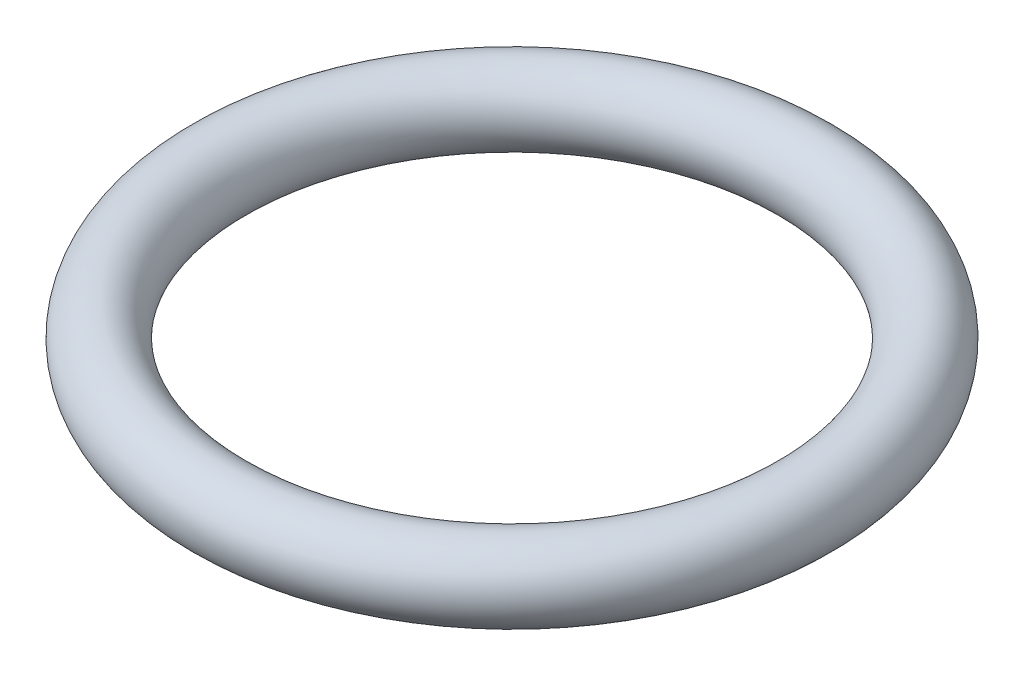
ISO-10303-21;
HEADER;
FILE_DESCRIPTION(('STEP AP214'),'2;1');
FILE_NAME('part.step','',(''),(''),'','','');
FILE_SCHEMA(('AUTOMOTIVE_DESIGN { 1 0 10303 214 1 1 1 1 }'));
ENDSEC;
DATA;
#1=APPLICATION_CONTEXT('core data for automotive mechanical design processes');
#2=APPLICATION_PROTOCOL_DEFINITION('international standard','automotive_design',2000,#1);
#3=PRODUCT_CONTEXT('',#1,'mechanical');
#4=PRODUCT('Part','Part','',(#3));
#5=PRODUCT_RELATED_PRODUCT_CATEGORY('part','',(#4));
#6=PRODUCT_DEFINITION_FORMATION('','',#4);
#7=PRODUCT_DEFINITION_CONTEXT('part definition',#1,'design');
#8=PRODUCT_DEFINITION('design','',#6,#7);
#9=PRODUCT_DEFINITION_SHAPE('','',#8);
#10=(LENGTH_UNIT() NAMED_UNIT(*) SI_UNIT(.MILLI.,.METRE.));
#11=(NAMED_UNIT(*) PLANE_ANGLE_UNIT() SI_UNIT($,.RADIAN.));
#12=(NAMED_UNIT(*) SI_UNIT($,.STERADIAN.) SOLID_ANGLE_UNIT());
#13=UNCERTAINTY_MEASURE_WITH_UNIT(LENGTH_MEASURE(1.E-05),#10,'distance_accuracy_value','');
#14=(GEOMETRIC_REPRESENTATION_CONTEXT(3) GLOBAL_UNCERTAINTY_ASSIGNED_CONTEXT((#13)) GLOBAL_UNIT_ASSIGNED_CONTEXT((#10,
#11,#12)) REPRESENTATION_CONTEXT('',''));
#15=CARTESIAN_POINT('',(0.,0.,0.));
#16=DIRECTION('',(0.,0.,1.));
#17=DIRECTION('',(1.,0.,0.));
#18=AXIS2_PLACEMENT_3D('',#15,#16,#17);
#19=CARTESIAN_POINT('',(5.875,0.,0.));
#20=DIRECTION('',(0.,-1.,0.));
#21=DIRECTION('',(0.,0.,-1.));
#22=AXIS2_PLACEMENT_3D('',#19,#20,#21);
#23=TOROIDAL_SURFACE('',#22,5.875,0.75);
#24=CARTESIAN_POINT('',(5.875,0.,-6.625));
#25=VERTEX_POINT('',#24);
#26=VERTEX_LOOP('',#25);
#27=FACE_BOUND('',#26,.T.);
#28=ADVANCED_FACE('F29',(#27),#23,.T.);
#29=CLOSED_SHELL('',(#28));
#30=MANIFOLD_SOLID_BREP('B2',#29);
#31=ADVANCED_BREP_SHAPE_REPRESENTATION('',(#18,#30),#14);
#32=SHAPE_DEFINITION_REPRESENTATION(#9,#31);
ENDSEC;
END-ISO-10303-21;
